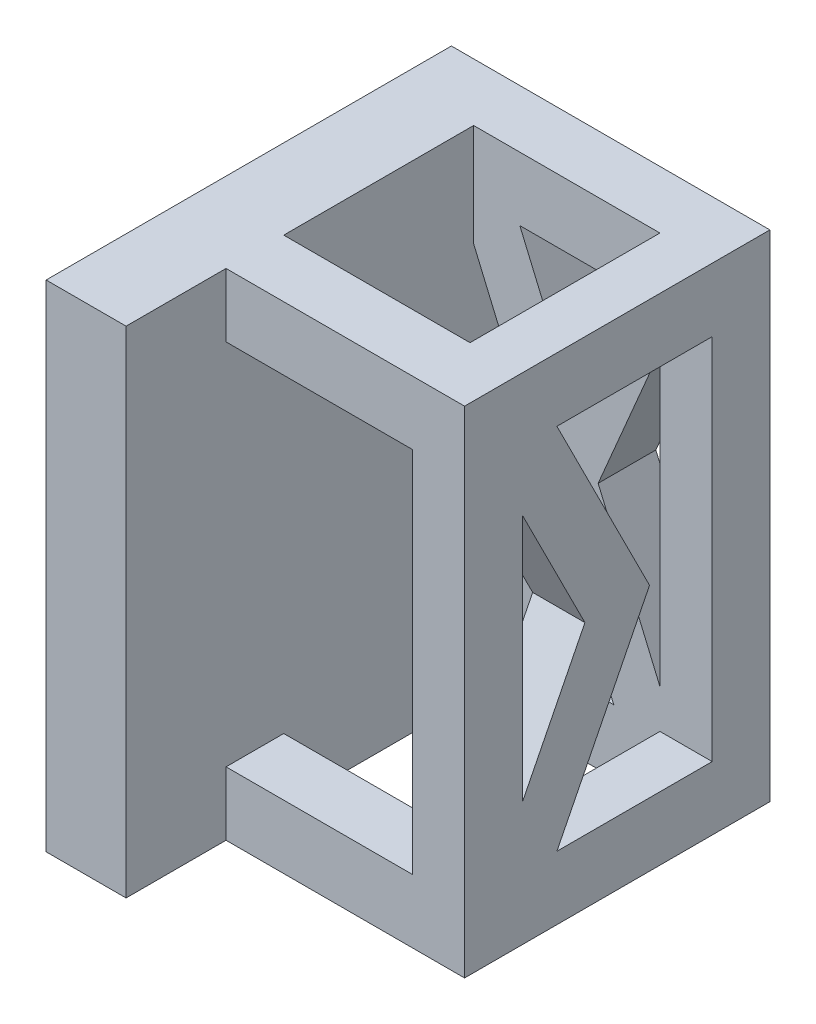
ISO-10303-21;
HEADER;
FILE_DESCRIPTION(('STEP AP214'),'2;1');
FILE_NAME('part.step','',(''),(''),'','','');
FILE_SCHEMA(('AUTOMOTIVE_DESIGN { 1 0 10303 214 1 1 1 1 }'));
ENDSEC;
DATA;
#1=APPLICATION_CONTEXT('core data for automotive mechanical design processes');
#2=APPLICATION_PROTOCOL_DEFINITION('international standard','automotive_design',2000,#1);
#3=PRODUCT_CONTEXT('',#1,'mechanical');
#4=PRODUCT('Part','Part','',(#3));
#5=PRODUCT_RELATED_PRODUCT_CATEGORY('part','',(#4));
#6=PRODUCT_DEFINITION_FORMATION('','',#4);
#7=PRODUCT_DEFINITION_CONTEXT('part definition',#1,'design');
#8=PRODUCT_DEFINITION('design','',#6,#7);
#9=PRODUCT_DEFINITION_SHAPE('','',#8);
#10=(LENGTH_UNIT() NAMED_UNIT(*) SI_UNIT(.MILLI.,.METRE.));
#11=(NAMED_UNIT(*) PLANE_ANGLE_UNIT() SI_UNIT($,.RADIAN.));
#12=(NAMED_UNIT(*) SI_UNIT($,.STERADIAN.) SOLID_ANGLE_UNIT());
#13=UNCERTAINTY_MEASURE_WITH_UNIT(LENGTH_MEASURE(1.E-05),#10,'distance_accuracy_value','');
#14=(GEOMETRIC_REPRESENTATION_CONTEXT(3) GLOBAL_UNCERTAINTY_ASSIGNED_CONTEXT((#13)) GLOBAL_UNIT_ASSIGNED_CONTEXT((#10,
#11,#12)) REPRESENTATION_CONTEXT('',''));
#15=CARTESIAN_POINT('',(0.,0.,0.));
#16=DIRECTION('',(0.,0.,1.));
#17=DIRECTION('',(1.,0.,0.));
#18=AXIS2_PLACEMENT_3D('',#15,#16,#17);
#19=CARTESIAN_POINT('',(0.,0.,-57.1875));
#20=DIRECTION('',(0.,0.,-1.));
#21=DIRECTION('',(-1.,0.,0.));
#22=AXIS2_PLACEMENT_3D('',#19,#20,#21);
#23=PLANE('',#22);
#24=DIRECTION('',(-1.,0.,0.));
#25=VECTOR('',#24,1.);
#26=CARTESIAN_POINT('',(0.,37.25,-57.1875));
#27=LINE('',#26,#25);
#28=CARTESIAN_POINT('',(10.25,37.25,-57.1875));
#29=VERTEX_POINT('',#28);
#30=CARTESIAN_POINT('',(-10.25,37.25,-57.1875));
#31=VERTEX_POINT('',#30);
#32=EDGE_CURVE('E74',#29,#31,#27,.T.);
#33=ORIENTED_EDGE('',*,*,#32,.F.);
#34=DIRECTION('',(0.,-1.,0.));
#35=VECTOR('',#34,1.);
#36=CARTESIAN_POINT('',(10.25,0.,-57.1875));
#37=LINE('',#36,#35);
#38=CARTESIAN_POINT('',(10.25,30.25,-57.1875));
#39=VERTEX_POINT('',#38);
#40=EDGE_CURVE('E621',#29,#39,#37,.T.);
#41=ORIENTED_EDGE('',*,*,#40,.T.);
#42=DIRECTION('',(-1.,0.,0.));
#43=VECTOR('',#42,1.);
#44=CARTESIAN_POINT('',(10.25,30.25,-57.1875));
#45=LINE('',#44,#43);
#46=CARTESIAN_POINT('',(-10.25,30.25,-57.1875));
#47=VERTEX_POINT('',#46);
#48=EDGE_CURVE('E405',#39,#47,#45,.T.);
#49=ORIENTED_EDGE('',*,*,#48,.T.);
#50=DIRECTION('',(0.,-1.,0.));
#51=VECTOR('',#50,1.);
#52=CARTESIAN_POINT('',(-10.25,37.25,-57.1875));
#53=LINE('',#52,#51);
#54=EDGE_CURVE('E407',#31,#47,#53,.T.);
#55=ORIENTED_EDGE('',*,*,#54,.F.);
#56=EDGE_LOOP('',(#33,#41,#49,#55));
#57=FACE_BOUND('',#56,.T.);
#58=ADVANCED_FACE('F59',(#57),#23,.T.);
#59=DIRECTION('',(1.,0.,0.));
#60=VECTOR('',#59,1.);
#61=CARTESIAN_POINT('',(-10.25,-10.25,-57.1875));
#62=LINE('',#61,#60);
#63=CARTESIAN_POINT('',(-10.25,-10.25,-57.1875));
#64=VERTEX_POINT('',#63);
#65=CARTESIAN_POINT('',(10.25,-10.25,-57.1875));
#66=VERTEX_POINT('',#65);
#67=EDGE_CURVE('E389',#64,#66,#62,.T.);
#68=ORIENTED_EDGE('',*,*,#67,.T.);
#69=DIRECTION('',(0.,-1.,0.));
#70=VECTOR('',#69,1.);
#71=CARTESIAN_POINT('',(10.25,0.,-57.1875));
#72=LINE('',#71,#70);
#73=CARTESIAN_POINT('',(10.25,-17.25,-57.1875));
#74=VERTEX_POINT('',#73);
#75=EDGE_CURVE('E82',#66,#74,#72,.T.);
#76=ORIENTED_EDGE('',*,*,#75,.T.);
#77=DIRECTION('',(1.,0.,0.));
#78=VECTOR('',#77,1.);
#79=CARTESIAN_POINT('',(-10.25,-17.25,-57.1875));
#80=LINE('',#79,#78);
#81=CARTESIAN_POINT('',(-10.25,-17.25,-57.1875));
#82=VERTEX_POINT('',#81);
#83=EDGE_CURVE('E383',#82,#74,#80,.T.);
#84=ORIENTED_EDGE('',*,*,#83,.F.);
#85=DIRECTION('',(0.,-1.,0.));
#86=VECTOR('',#85,1.);
#87=CARTESIAN_POINT('',(-10.25,-10.25,-57.1875));
#88=LINE('',#87,#86);
#89=EDGE_CURVE('E385',#64,#82,#88,.T.);
#90=ORIENTED_EDGE('',*,*,#89,.F.);
#91=EDGE_LOOP('',(#68,#76,#84,#90));
#92=FACE_BOUND('',#91,.T.);
#93=ADVANCED_FACE('F551',(#92),#23,.T.);
#94=CARTESIAN_POINT('',(-10.25,37.25,15.3683873672003));
#95=DIRECTION('',(1.,0.,0.));
#96=DIRECTION('',(0.,1.,0.));
#97=AXIS2_PLACEMENT_3D('',#94,#95,#96);
#98=PLANE('',#97);
#99=DIRECTION('',(0.,0.,1.));
#100=VECTOR('',#99,1.);
#101=CARTESIAN_POINT('',(-10.25,30.25,-57.1875));
#102=LINE('',#101,#100);
#103=CARTESIAN_POINT('',(-10.25,30.25,-50.8375));
#104=VERTEX_POINT('',#103);
#105=EDGE_CURVE('E396',#47,#104,#102,.T.);
#106=ORIENTED_EDGE('',*,*,#105,.T.);
#107=DIRECTION('',(0.,-1.,0.));
#108=VECTOR('',#107,1.);
#109=CARTESIAN_POINT('',(-10.25,37.25,-50.8375));
#110=LINE('',#109,#108);
#111=CARTESIAN_POINT('',(-10.25,37.25,-50.8375));
#112=VERTEX_POINT('',#111);
#113=EDGE_CURVE('E408',#112,#104,#110,.T.);
#114=ORIENTED_EDGE('',*,*,#113,.F.);
#115=DIRECTION('',(0.,0.,-1.));
#116=VECTOR('',#115,1.);
#117=CARTESIAN_POINT('',(-10.25,37.25,15.3683873672003));
#118=LINE('',#117,#116);
#119=CARTESIAN_POINT('',(-10.25,37.25,-39.8375));
#120=VERTEX_POINT('',#119);
#121=EDGE_CURVE('E424',#120,#112,#118,.T.);
#122=ORIENTED_EDGE('',*,*,#121,.F.);
#123=DIRECTION('',(0.,1.,0.));
#124=VECTOR('',#123,1.);
#125=CARTESIAN_POINT('',(-10.25,37.25,-39.8375));
#126=LINE('',#125,#124);
#127=CARTESIAN_POINT('',(-10.25,-17.25,-39.8375));
#128=VERTEX_POINT('',#127);
#129=EDGE_CURVE('E67',#128,#120,#126,.T.);
#130=ORIENTED_EDGE('',*,*,#129,.F.);
#131=DIRECTION('',(0.,0.,-1.));
#132=VECTOR('',#131,1.);
#133=CARTESIAN_POINT('',(-10.25,-17.25,15.3683873672003));
#134=LINE('',#133,#132);
#135=CARTESIAN_POINT('',(-10.25,-17.25,-50.8375));
#136=VERTEX_POINT('',#135);
#137=EDGE_CURVE('E433',#128,#136,#134,.T.);
#138=ORIENTED_EDGE('',*,*,#137,.T.);
#139=DIRECTION('',(0.,-1.,0.));
#140=VECTOR('',#139,1.);
#141=CARTESIAN_POINT('',(-10.25,-10.25,-50.8375));
#142=LINE('',#141,#140);
#143=CARTESIAN_POINT('',(-10.25,-10.25,-50.8375));
#144=VERTEX_POINT('',#143);
#145=EDGE_CURVE('E395',#144,#136,#142,.T.);
#146=ORIENTED_EDGE('',*,*,#145,.F.);
#147=DIRECTION('',(0.,0.,1.));
#148=VECTOR('',#147,1.);
#149=CARTESIAN_POINT('',(-10.25,-10.25,-57.1875));
#150=LINE('',#149,#148);
#151=EDGE_CURVE('E391',#64,#144,#150,.T.);
#152=ORIENTED_EDGE('',*,*,#151,.F.);
#153=ORIENTED_EDGE('',*,*,#89,.T.);
#154=CARTESIAN_POINT('',(-10.25,-17.25,-78.0875));
#155=VERTEX_POINT('',#154);
#156=EDGE_CURVE('E420',#82,#155,#134,.T.);
#157=ORIENTED_EDGE('',*,*,#156,.T.);
#158=DIRECTION('',(0.,-1.,0.));
#159=VECTOR('',#158,1.);
#160=CARTESIAN_POINT('',(-10.25,37.25,-78.0875));
#161=LINE('',#160,#159);
#162=CARTESIAN_POINT('',(-10.25,-5.97138937639835,-78.0875));
#163=VERTEX_POINT('',#162);
#164=EDGE_CURVE('E417',#163,#155,#161,.T.);
#165=ORIENTED_EDGE('',*,*,#164,.F.);
#166=DIRECTION('',(0.,0.,1.));
#167=VECTOR('',#166,1.);
#168=CARTESIAN_POINT('',(-10.25,-5.9713893763984,-84.4375));
#169=LINE('',#168,#167);
#170=CARTESIAN_POINT('',(-10.25,-5.9713893763984,-84.4375));
#171=VERTEX_POINT('',#170);
#172=EDGE_CURVE('E346',#171,#163,#169,.T.);
#173=ORIENTED_EDGE('',*,*,#172,.F.);
#174=DIRECTION('',(0.,-1.,0.));
#175=VECTOR('',#174,1.);
#176=CARTESIAN_POINT('',(-10.25,0.,-84.4375));
#177=LINE('',#176,#175);
#178=CARTESIAN_POINT('',(-10.25,25.9713893763984,-84.4375));
#179=VERTEX_POINT('',#178);
#180=EDGE_CURVE('E532',#179,#171,#177,.T.);
#181=ORIENTED_EDGE('',*,*,#180,.F.);
#182=DIRECTION('',(0.,0.,1.));
#183=VECTOR('',#182,1.);
#184=CARTESIAN_POINT('',(-10.25,25.9713893763984,-84.4375));
#185=LINE('',#184,#183);
#186=CARTESIAN_POINT('',(-10.25,25.9713893763984,-78.0875));
#187=VERTEX_POINT('',#186);
#188=EDGE_CURVE('E349',#179,#187,#185,.T.);
#189=ORIENTED_EDGE('',*,*,#188,.T.);
#190=CARTESIAN_POINT('',(-10.25,37.25,-78.0875));
#191=VERTEX_POINT('',#190);
#192=EDGE_CURVE('E418',#191,#187,#161,.T.);
#193=ORIENTED_EDGE('',*,*,#192,.F.);
#194=EDGE_CURVE('E429',#31,#191,#118,.T.);
#195=ORIENTED_EDGE('',*,*,#194,.F.);
#196=ORIENTED_EDGE('',*,*,#54,.T.);
#197=EDGE_LOOP('',(#106,#114,#122,#130,#138,#146,#152,#153,#157,#165,#173,#181,#189,#193,#195,#196));
#198=FACE_BOUND('',#197,.T.);
#199=ADVANCED_FACE('F61',(#198),#98,.T.);
#200=CARTESIAN_POINT('',(-10.25,37.25,15.3683873672003));
#201=DIRECTION('',(0.,1.,0.));
#202=DIRECTION('',(0.,0.,1.));
#203=AXIS2_PLACEMENT_3D('',#200,#201,#202);
#204=PLANE('',#203);
#205=DIRECTION('',(0.,0.,1.));
#206=VECTOR('',#205,1.);
#207=CARTESIAN_POINT('',(10.25,37.25,0.));
#208=LINE('',#207,#206);
#209=CARTESIAN_POINT('',(10.25,37.25,-78.0875));
#210=VERTEX_POINT('',#209);
#211=EDGE_CURVE('E623',#210,#29,#208,.T.);
#212=ORIENTED_EDGE('',*,*,#211,.T.);
#213=ORIENTED_EDGE('',*,*,#32,.T.);
#214=ORIENTED_EDGE('',*,*,#194,.T.);
#215=DIRECTION('',(-1.,0.,0.));
#216=VECTOR('',#215,1.);
#217=CARTESIAN_POINT('',(0.,37.25,-78.0875));
#218=LINE('',#217,#216);
#219=EDGE_CURVE('E313',#210,#191,#218,.T.);
#220=ORIENTED_EDGE('',*,*,#219,.F.);
#221=EDGE_LOOP('',(#212,#213,#214,#220));
#222=FACE_BOUND('',#221,.T.);
#223=DIRECTION('',(-1.,0.,0.));
#224=VECTOR('',#223,1.);
#225=CARTESIAN_POINT('',(-10.25,37.25,-39.8375));
#226=LINE('',#225,#224);
#227=CARTESIAN_POINT('',(-19.05,37.25,-39.8375));
#228=VERTEX_POINT('',#227);
#229=EDGE_CURVE('E423',#120,#228,#226,.T.);
#230=ORIENTED_EDGE('',*,*,#229,.F.);
#231=ORIENTED_EDGE('',*,*,#121,.T.);
#232=DIRECTION('',(-1.,0.,0.));
#233=VECTOR('',#232,1.);
#234=CARTESIAN_POINT('',(0.,37.25,-50.8375));
#235=LINE('',#234,#233);
#236=CARTESIAN_POINT('',(16.,37.25,-50.8375));
#237=VERTEX_POINT('',#236);
#238=EDGE_CURVE('E374',#237,#112,#235,.T.);
#239=ORIENTED_EDGE('',*,*,#238,.F.);
#240=DIRECTION('',(0.,0.,1.));
#241=VECTOR('',#240,1.);
#242=CARTESIAN_POINT('',(16.,37.25,-57.1875));
#243=LINE('',#242,#241);
#244=CARTESIAN_POINT('',(16.,37.25,-84.4375));
#245=VERTEX_POINT('',#244);
#246=EDGE_CURVE('E370',#245,#237,#243,.T.);
#247=ORIENTED_EDGE('',*,*,#246,.F.);
#248=DIRECTION('',(-1.,0.,0.));
#249=VECTOR('',#248,1.);
#250=CARTESIAN_POINT('',(0.,37.25,-84.4375));
#251=LINE('',#250,#249);
#252=CARTESIAN_POINT('',(-19.05,37.25,-84.4375));
#253=VERTEX_POINT('',#252);
#254=EDGE_CURVE('E491',#245,#253,#251,.T.);
#255=ORIENTED_EDGE('',*,*,#254,.T.);
#256=DIRECTION('',(0.,0.,-1.));
#257=VECTOR('',#256,1.);
#258=CARTESIAN_POINT('',(-19.05,37.25,15.3683873672003));
#259=LINE('',#258,#257);
#260=EDGE_CURVE('E430',#228,#253,#259,.T.);
#261=ORIENTED_EDGE('',*,*,#260,.F.);
#262=EDGE_LOOP('',(#230,#231,#239,#247,#255,#261));
#263=FACE_BOUND('',#262,.T.);
#264=ADVANCED_FACE('F654',(#222,#263),#204,.T.);
#265=CARTESIAN_POINT('',(-19.05,37.25,15.3683873672003));
#266=DIRECTION('',(-1.,0.,0.));
#267=DIRECTION('',(0.,-1.,0.));
#268=AXIS2_PLACEMENT_3D('',#265,#266,#267);
#269=PLANE('',#268);
#270=DIRECTION('',(0.,-1.,0.));
#271=VECTOR('',#270,1.);
#272=CARTESIAN_POINT('',(-19.05,37.25,-39.8375));
#273=LINE('',#272,#271);
#274=CARTESIAN_POINT('',(-19.05,-17.25,-39.8375));
#275=VERTEX_POINT('',#274);
#276=EDGE_CURVE('E421',#228,#275,#273,.T.);
#277=ORIENTED_EDGE('',*,*,#276,.F.);
#278=ORIENTED_EDGE('',*,*,#260,.T.);
#279=DIRECTION('',(0.,1.,0.));
#280=VECTOR('',#279,1.);
#281=CARTESIAN_POINT('',(-19.05,0.,-84.4375));
#282=LINE('',#281,#280);
#283=CARTESIAN_POINT('',(-19.05,-17.25,-84.4375));
#284=VERTEX_POINT('',#283);
#285=EDGE_CURVE('E488',#284,#253,#282,.T.);
#286=ORIENTED_EDGE('',*,*,#285,.F.);
#287=DIRECTION('',(0.,0.,-1.));
#288=VECTOR('',#287,1.);
#289=CARTESIAN_POINT('',(-19.05,-17.25,15.3683873672003));
#290=LINE('',#289,#288);
#291=EDGE_CURVE('E432',#275,#284,#290,.T.);
#292=ORIENTED_EDGE('',*,*,#291,.F.);
#293=EDGE_LOOP('',(#277,#278,#286,#292));
#294=FACE_BOUND('',#293,.T.);
#295=ADVANCED_FACE('F767',(#294),#269,.T.);
#296=CARTESIAN_POINT('',(-10.25,-17.25,15.3683873672003));
#297=DIRECTION('',(0.,-1.,0.));
#298=DIRECTION('',(0.,0.,-1.));
#299=AXIS2_PLACEMENT_3D('',#296,#297,#298);
#300=PLANE('',#299);
#301=DIRECTION('',(-1.,0.,0.));
#302=VECTOR('',#301,1.);
#303=CARTESIAN_POINT('',(0.,-17.25,-84.4375));
#304=LINE('',#303,#302);
#305=CARTESIAN_POINT('',(16.,-17.25,-84.4375));
#306=VERTEX_POINT('',#305);
#307=EDGE_CURVE('E480',#306,#284,#304,.T.);
#308=ORIENTED_EDGE('',*,*,#307,.F.);
#309=DIRECTION('',(0.,0.,1.));
#310=VECTOR('',#309,1.);
#311=CARTESIAN_POINT('',(16.,-17.25,-57.1875));
#312=LINE('',#311,#310);
#313=CARTESIAN_POINT('',(16.,-17.25,-50.8375));
#314=VERTEX_POINT('',#313);
#315=EDGE_CURVE('E375',#306,#314,#312,.T.);
#316=ORIENTED_EDGE('',*,*,#315,.T.);
#317=DIRECTION('',(1.,0.,0.));
#318=VECTOR('',#317,1.);
#319=CARTESIAN_POINT('',(-10.25,-17.25,-50.8375));
#320=LINE('',#319,#318);
#321=EDGE_CURVE('E392',#136,#314,#320,.T.);
#322=ORIENTED_EDGE('',*,*,#321,.F.);
#323=ORIENTED_EDGE('',*,*,#137,.F.);
#324=DIRECTION('',(1.,0.,0.));
#325=VECTOR('',#324,1.);
#326=CARTESIAN_POINT('',(-10.25,-17.25,-39.8375));
#327=LINE('',#326,#325);
#328=EDGE_CURVE('E12',#275,#128,#327,.T.);
#329=ORIENTED_EDGE('',*,*,#328,.F.);
#330=ORIENTED_EDGE('',*,*,#291,.T.);
#331=EDGE_LOOP('',(#308,#316,#322,#323,#329,#330));
#332=FACE_BOUND('',#331,.T.);
#333=ORIENTED_EDGE('',*,*,#83,.T.);
#334=DIRECTION('',(0.,0.,-1.));
#335=VECTOR('',#334,1.);
#336=CARTESIAN_POINT('',(10.25,-17.25,0.));
#337=LINE('',#336,#335);
#338=CARTESIAN_POINT('',(10.25,-17.25,-78.0875));
#339=VERTEX_POINT('',#338);
#340=EDGE_CURVE('E523',#74,#339,#337,.T.);
#341=ORIENTED_EDGE('',*,*,#340,.T.);
#342=DIRECTION('',(-1.,0.,0.));
#343=VECTOR('',#342,1.);
#344=CARTESIAN_POINT('',(0.,-17.25,-78.0875));
#345=LINE('',#344,#343);
#346=EDGE_CURVE('E310',#339,#155,#345,.T.);
#347=ORIENTED_EDGE('',*,*,#346,.T.);
#348=ORIENTED_EDGE('',*,*,#156,.F.);
#349=EDGE_LOOP('',(#333,#341,#347,#348));
#350=FACE_BOUND('',#349,.T.);
#351=ADVANCED_FACE('F639',(#332,#350),#300,.T.);
#352=CARTESIAN_POINT('',(0.,10.0190841311277,-39.8375));
#353=DIRECTION('',(0.,0.,-1.));
#354=DIRECTION('',(0.,1.,0.));
#355=AXIS2_PLACEMENT_3D('',#352,#353,#354);
#356=PLANE('',#355);
#357=ORIENTED_EDGE('',*,*,#129,.T.);
#358=ORIENTED_EDGE('',*,*,#229,.T.);
#359=ORIENTED_EDGE('',*,*,#276,.T.);
#360=ORIENTED_EDGE('',*,*,#328,.T.);
#361=EDGE_LOOP('',(#357,#358,#359,#360));
#362=FACE_BOUND('',#361,.T.);
#363=ADVANCED_FACE('F778',(#362),#356,.F.);
#364=CARTESIAN_POINT('',(16.,0.,-57.1875));
#365=DIRECTION('',(1.,0.,0.));
#366=DIRECTION('',(0.,1.,0.));
#367=AXIS2_PLACEMENT_3D('',#364,#365,#366);
#368=PLANE('',#367);
#369=DIRECTION('',(0.,-1.,0.));
#370=VECTOR('',#369,1.);
#371=CARTESIAN_POINT('',(16.,0.,-84.4375));
#372=LINE('',#371,#370);
#373=EDGE_CURVE('E476',#245,#306,#372,.T.);
#374=ORIENTED_EDGE('',*,*,#373,.F.);
#375=ORIENTED_EDGE('',*,*,#246,.T.);
#376=DIRECTION('',(0.,1.,0.));
#377=VECTOR('',#376,1.);
#378=CARTESIAN_POINT('',(16.,0.,-50.8375));
#379=LINE('',#378,#377);
#380=EDGE_CURVE('E365',#314,#237,#379,.T.);
#381=ORIENTED_EDGE('',*,*,#380,.F.);
#382=ORIENTED_EDGE('',*,*,#315,.F.);
#383=EDGE_LOOP('',(#374,#375,#381,#382));
#384=FACE_BOUND('',#383,.T.);
#385=DIRECTION('',(0.,1.,0.));
#386=VECTOR('',#385,1.);
#387=CARTESIAN_POINT('',(16.,0.,-57.1875));
#388=LINE('',#387,#386);
#389=CARTESIAN_POINT('',(16.,-3.69646346391572,-57.1875));
#390=VERTEX_POINT('',#389);
#391=CARTESIAN_POINT('',(16.,23.6964634639157,-57.1875));
#392=VERTEX_POINT('',#391);
#393=EDGE_CURVE('E367',#390,#392,#388,.T.);
#394=ORIENTED_EDGE('',*,*,#393,.T.);
#395=DIRECTION('',(0.,-0.893194857293405,-0.449669819872998));
#396=VECTOR('',#395,1.);
#397=CARTESIAN_POINT('',(16.,27.760440686772,-55.1415322127387));
#398=LINE('',#397,#396);
#399=CARTESIAN_POINT('',(16.,10.,-64.0828445134906));
#400=VERTEX_POINT('',#399);
#401=EDGE_CURVE('E586',#392,#400,#398,.T.);
#402=ORIENTED_EDGE('',*,*,#401,.T.);
#403=DIRECTION('',(0.,-0.893194857293405,0.449669819872998));
#404=VECTOR('',#403,1.);
#405=CARTESIAN_POINT('',(16.,-23.7163817486797,-47.1086768009265));
#406=LINE('',#405,#404);
#407=EDGE_CURVE('E303',#400,#390,#406,.T.);
#408=ORIENTED_EDGE('',*,*,#407,.T.);
#409=EDGE_LOOP('',(#394,#402,#408));
#410=FACE_BOUND('',#409,.T.);
#411=DIRECTION('',(0.,-1.,0.));
#412=VECTOR('',#411,1.);
#413=CARTESIAN_POINT('',(16.,0.,-78.0875));
#414=LINE('',#413,#412);
#415=CARTESIAN_POINT('',(16.,30.25,-78.0875));
#416=VERTEX_POINT('',#415);
#417=CARTESIAN_POINT('',(16.,-10.25,-78.0875));
#418=VERTEX_POINT('',#417);
#419=EDGE_CURVE('E300',#416,#418,#414,.T.);
#420=ORIENTED_EDGE('',*,*,#419,.T.);
#421=DIRECTION('',(0.,0.,1.));
#422=VECTOR('',#421,1.);
#423=CARTESIAN_POINT('',(16.,-10.25,0.));
#424=LINE('',#423,#422);
#425=CARTESIAN_POINT('',(16.,-10.25,-60.9975));
#426=VERTEX_POINT('',#425);
#427=EDGE_CURVE('E282',#418,#426,#424,.T.);
#428=ORIENTED_EDGE('',*,*,#427,.T.);
#429=DIRECTION('',(0.,0.893194857293405,-0.449669819872998));
#430=VECTOR('',#429,1.);
#431=CARTESIAN_POINT('',(16.,-26.5717851048732,-52.7804641447396));
#432=LINE('',#431,#430);
#433=CARTESIAN_POINT('',(16.,10.,-71.1921554865094));
#434=VERTEX_POINT('',#433);
#435=EDGE_CURVE('E294',#426,#434,#432,.T.);
#436=ORIENTED_EDGE('',*,*,#435,.T.);
#437=DIRECTION('',(0.,-0.893194857293405,-0.449669819872998));
#438=VECTOR('',#437,1.);
#439=CARTESIAN_POINT('',(16.,30.6158440429655,-60.8133195565518));
#440=LINE('',#439,#438);
#441=CARTESIAN_POINT('',(16.,30.25,-60.9975));
#442=VERTEX_POINT('',#441);
#443=EDGE_CURVE('E592',#442,#434,#440,.T.);
#444=ORIENTED_EDGE('',*,*,#443,.F.);
#445=DIRECTION('',(0.,0.,-1.));
#446=VECTOR('',#445,1.);
#447=CARTESIAN_POINT('',(16.,30.25,0.));
#448=LINE('',#447,#446);
#449=EDGE_CURVE('E308',#442,#416,#448,.T.);
#450=ORIENTED_EDGE('',*,*,#449,.T.);
#451=EDGE_LOOP('',(#420,#428,#436,#444,#450));
#452=FACE_BOUND('',#451,.T.);
#453=ADVANCED_FACE('F305',(#384,#410,#452),#368,.T.);
#454=CARTESIAN_POINT('',(0.,0.,-50.8375));
#455=DIRECTION('',(0.,0.,-1.));
#456=DIRECTION('',(-1.,0.,0.));
#457=AXIS2_PLACEMENT_3D('',#454,#455,#456);
#458=PLANE('',#457);
#459=DIRECTION('',(0.,1.,0.));
#460=VECTOR('',#459,1.);
#461=CARTESIAN_POINT('',(10.25,0.,-50.8375));
#462=LINE('',#461,#460);
#463=CARTESIAN_POINT('',(10.25,-10.25,-50.8375));
#464=VERTEX_POINT('',#463);
#465=CARTESIAN_POINT('',(10.25,30.25,-50.8375));
#466=VERTEX_POINT('',#465);
#467=EDGE_CURVE('E371',#464,#466,#462,.T.);
#468=ORIENTED_EDGE('',*,*,#467,.F.);
#469=DIRECTION('',(1.,0.,0.));
#470=VECTOR('',#469,1.);
#471=CARTESIAN_POINT('',(-10.25,-10.25,-50.8375));
#472=LINE('',#471,#470);
#473=EDGE_CURVE('E386',#144,#464,#472,.T.);
#474=ORIENTED_EDGE('',*,*,#473,.F.);
#475=ORIENTED_EDGE('',*,*,#145,.T.);
#476=ORIENTED_EDGE('',*,*,#321,.T.);
#477=ORIENTED_EDGE('',*,*,#380,.T.);
#478=ORIENTED_EDGE('',*,*,#238,.T.);
#479=ORIENTED_EDGE('',*,*,#113,.T.);
#480=DIRECTION('',(-1.,0.,0.));
#481=VECTOR('',#480,1.);
#482=CARTESIAN_POINT('',(10.25,30.25,-50.8375));
#483=LINE('',#482,#481);
#484=EDGE_CURVE('E338',#466,#104,#483,.T.);
#485=ORIENTED_EDGE('',*,*,#484,.F.);
#486=EDGE_LOOP('',(#468,#474,#475,#476,#477,#478,#479,#485));
#487=FACE_BOUND('',#486,.T.);
#488=ADVANCED_FACE('F561',(#487),#458,.F.);
#489=DIRECTION('',(1.,0.,0.));
#490=VECTOR('',#489,1.);
#491=CARTESIAN_POINT('',(-48.120026554731,23.6964634639157,-57.1875));
#492=LINE('',#491,#490);
#493=CARTESIAN_POINT('',(10.25,23.6964634639157,-57.1875));
#494=VERTEX_POINT('',#493);
#495=EDGE_CURVE('E573',#494,#392,#492,.T.);
#496=ORIENTED_EDGE('',*,*,#495,.T.);
#497=ORIENTED_EDGE('',*,*,#393,.F.);
#498=DIRECTION('',(1.,0.,0.));
#499=VECTOR('',#498,1.);
#500=CARTESIAN_POINT('',(-48.120026554731,-3.69646346391573,-57.1875));
#501=LINE('',#500,#499);
#502=CARTESIAN_POINT('',(10.25,-3.69646346391573,-57.1875));
#503=VERTEX_POINT('',#502);
#504=EDGE_CURVE('E596',#503,#390,#501,.T.);
#505=ORIENTED_EDGE('',*,*,#504,.F.);
#506=DIRECTION('',(0.,1.,0.));
#507=VECTOR('',#506,1.);
#508=CARTESIAN_POINT('',(10.25,0.,-57.1875));
#509=LINE('',#508,#507);
#510=EDGE_CURVE('E363',#503,#494,#509,.T.);
#511=ORIENTED_EDGE('',*,*,#510,.T.);
#512=EDGE_LOOP('',(#496,#497,#505,#511));
#513=FACE_BOUND('',#512,.T.);
#514=ADVANCED_FACE('F553',(#513),#23,.T.);
#515=CARTESIAN_POINT('',(10.25,0.,-57.1875));
#516=DIRECTION('',(1.,0.,0.));
#517=DIRECTION('',(0.,0.,-1.));
#518=AXIS2_PLACEMENT_3D('',#515,#516,#517);
#519=PLANE('',#518);
#520=DIRECTION('',(0.,0.893194857293405,0.449669819872998));
#521=VECTOR('',#520,1.);
#522=CARTESIAN_POINT('',(10.25,27.760440686772,-55.1415322127387));
#523=LINE('',#522,#521);
#524=CARTESIAN_POINT('',(10.25,10.,-64.0828445134906));
#525=VERTEX_POINT('',#524);
#526=EDGE_CURVE('E619',#525,#494,#523,.T.);
#527=ORIENTED_EDGE('',*,*,#526,.T.);
#528=ORIENTED_EDGE('',*,*,#510,.F.);
#529=DIRECTION('',(0.,0.893194857293405,-0.449669819872998));
#530=VECTOR('',#529,1.);
#531=CARTESIAN_POINT('',(10.25,-23.7163817486797,-47.1086768009265));
#532=LINE('',#531,#530);
#533=EDGE_CURVE('E617',#503,#525,#532,.T.);
#534=ORIENTED_EDGE('',*,*,#533,.T.);
#535=EDGE_LOOP('',(#527,#528,#534));
#536=FACE_BOUND('',#535,.T.);
#537=DIRECTION('',(0.,0.,1.));
#538=VECTOR('',#537,1.);
#539=CARTESIAN_POINT('',(10.25,30.25,-57.1875));
#540=LINE('',#539,#538);
#541=EDGE_CURVE('E382',#39,#466,#540,.T.);
#542=ORIENTED_EDGE('',*,*,#541,.F.);
#543=ORIENTED_EDGE('',*,*,#40,.F.);
#544=ORIENTED_EDGE('',*,*,#211,.F.);
#545=DIRECTION('',(0.,1.,0.));
#546=VECTOR('',#545,1.);
#547=CARTESIAN_POINT('',(10.25,0.,-78.0875));
#548=LINE('',#547,#546);
#549=CARTESIAN_POINT('',(10.25,30.25,-78.0875));
#550=VERTEX_POINT('',#549);
#551=EDGE_CURVE('E626',#550,#210,#548,.T.);
#552=ORIENTED_EDGE('',*,*,#551,.F.);
#553=DIRECTION('',(0.,0.,1.));
#554=VECTOR('',#553,1.);
#555=CARTESIAN_POINT('',(10.25,30.25,0.));
#556=LINE('',#555,#554);
#557=CARTESIAN_POINT('',(10.25,30.25,-60.9975));
#558=VERTEX_POINT('',#557);
#559=EDGE_CURVE('E629',#550,#558,#556,.T.);
#560=ORIENTED_EDGE('',*,*,#559,.T.);
#561=DIRECTION('',(0.,0.893194857293405,0.449669819872998));
#562=VECTOR('',#561,1.);
#563=CARTESIAN_POINT('',(10.25,30.6158440429655,-60.8133195565518));
#564=LINE('',#563,#562);
#565=CARTESIAN_POINT('',(10.25,10.,-71.1921554865094));
#566=VERTEX_POINT('',#565);
#567=EDGE_CURVE('E631',#566,#558,#564,.T.);
#568=ORIENTED_EDGE('',*,*,#567,.F.);
#569=DIRECTION('',(0.,-0.893194857293405,0.449669819872998));
#570=VECTOR('',#569,1.);
#571=CARTESIAN_POINT('',(10.25,-26.5717851048732,-52.7804641447396));
#572=LINE('',#571,#570);
#573=CARTESIAN_POINT('',(10.25,-10.25,-60.9975));
#574=VERTEX_POINT('',#573);
#575=EDGE_CURVE('E609',#566,#574,#572,.T.);
#576=ORIENTED_EDGE('',*,*,#575,.T.);
#577=DIRECTION('',(0.,0.,-1.));
#578=VECTOR('',#577,1.);
#579=CARTESIAN_POINT('',(10.25,-10.25,0.));
#580=LINE('',#579,#578);
#581=CARTESIAN_POINT('',(10.25,-10.25,-78.0875));
#582=VERTEX_POINT('',#581);
#583=EDGE_CURVE('E634',#574,#582,#580,.T.);
#584=ORIENTED_EDGE('',*,*,#583,.T.);
#585=DIRECTION('',(0.,-1.,0.));
#586=VECTOR('',#585,1.);
#587=CARTESIAN_POINT('',(10.25,0.,-78.0875));
#588=LINE('',#587,#586);
#589=EDGE_CURVE('E302',#582,#339,#588,.T.);
#590=ORIENTED_EDGE('',*,*,#589,.T.);
#591=ORIENTED_EDGE('',*,*,#340,.F.);
#592=ORIENTED_EDGE('',*,*,#75,.F.);
#593=DIRECTION('',(0.,0.,1.));
#594=VECTOR('',#593,1.);
#595=CARTESIAN_POINT('',(10.25,-10.25,-57.1875));
#596=LINE('',#595,#594);
#597=EDGE_CURVE('E380',#66,#464,#596,.T.);
#598=ORIENTED_EDGE('',*,*,#597,.T.);
#599=ORIENTED_EDGE('',*,*,#467,.T.);
#600=EDGE_LOOP('',(#542,#543,#544,#552,#560,#568,#576,#584,#590,#591,#592,#598,#599));
#601=FACE_BOUND('',#600,.T.);
#602=ADVANCED_FACE('F560',(#536,#601),#519,.F.);
#603=CARTESIAN_POINT('',(10.25,30.25,-57.1875));
#604=DIRECTION('',(0.,1.,0.));
#605=DIRECTION('',(0.,0.,1.));
#606=AXIS2_PLACEMENT_3D('',#603,#604,#605);
#607=PLANE('',#606);
#608=ORIENTED_EDGE('',*,*,#484,.T.);
#609=ORIENTED_EDGE('',*,*,#105,.F.);
#610=ORIENTED_EDGE('',*,*,#48,.F.);
#611=ORIENTED_EDGE('',*,*,#541,.T.);
#612=EDGE_LOOP('',(#608,#609,#610,#611));
#613=FACE_BOUND('',#612,.T.);
#614=ADVANCED_FACE('F567',(#613),#607,.F.);
#615=CARTESIAN_POINT('',(-10.25,-10.25,-57.1875));
#616=DIRECTION('',(0.,-1.,0.));
#617=DIRECTION('',(1.,0.,0.));
#618=AXIS2_PLACEMENT_3D('',#615,#616,#617);
#619=PLANE('',#618);
#620=ORIENTED_EDGE('',*,*,#597,.F.);
#621=ORIENTED_EDGE('',*,*,#67,.F.);
#622=ORIENTED_EDGE('',*,*,#151,.T.);
#623=ORIENTED_EDGE('',*,*,#473,.T.);
#624=EDGE_LOOP('',(#620,#621,#622,#623));
#625=FACE_BOUND('',#624,.T.);
#626=ADVANCED_FACE('F570',(#625),#619,.F.);
#627=CARTESIAN_POINT('',(0.,0.,-78.0875));
#628=DIRECTION('',(0.,0.,-1.));
#629=DIRECTION('',(-1.,0.,0.));
#630=AXIS2_PLACEMENT_3D('',#627,#628,#629);
#631=PLANE('',#630);
#632=DIRECTION('',(-0.391698029375813,0.920093828793077,0.));
#633=VECTOR('',#632,1.);
#634=CARTESIAN_POINT('',(0.68269148937293,0.290632218900746,-78.0875));
#635=LINE('',#634,#633);
#636=CARTESIAN_POINT('',(5.17,-10.25,-78.0875));
#637=VERTEX_POINT('',#636);
#638=CARTESIAN_POINT('',(0.,1.89426608793643,-78.0875));
#639=VERTEX_POINT('',#638);
#640=EDGE_CURVE('E500',#637,#639,#635,.T.);
#641=ORIENTED_EDGE('',*,*,#640,.F.);
#642=DIRECTION('',(1.,0.,0.));
#643=VECTOR('',#642,1.);
#644=CARTESIAN_POINT('',(0.,-10.25,-78.0875));
#645=LINE('',#644,#643);
#646=CARTESIAN_POINT('',(-5.17000000000001,-10.25,-78.0875));
#647=VERTEX_POINT('',#646);
#648=EDGE_CURVE('E450',#647,#637,#645,.T.);
#649=ORIENTED_EDGE('',*,*,#648,.F.);
#650=DIRECTION('',(-0.391698029375813,-0.920093828793077,0.));
#651=VECTOR('',#650,1.);
#652=CARTESIAN_POINT('',(-0.682691489372934,0.290632218900748,-78.0875));
#653=LINE('',#652,#651);
#654=EDGE_CURVE('E454',#639,#647,#653,.T.);
#655=ORIENTED_EDGE('',*,*,#654,.F.);
#656=EDGE_LOOP('',(#641,#649,#655));
#657=FACE_BOUND('',#656,.T.);
#658=DIRECTION('',(-0.391698029375813,-0.920093828793077,0.));
#659=VECTOR('',#658,1.);
#660=CARTESIAN_POINT('',(-0.682691489372934,0.290632218900748,-78.0875));
#661=LINE('',#660,#659);
#662=CARTESIAN_POINT('',(10.25,25.9713893763984,-78.0875));
#663=VERTEX_POINT('',#662);
#664=CARTESIAN_POINT('',(3.45073502358424,9.99999999999999,-78.0875));
#665=VERTEX_POINT('',#664);
#666=EDGE_CURVE('E452',#663,#665,#661,.T.);
#667=ORIENTED_EDGE('',*,*,#666,.F.);
#668=DIRECTION('',(0.,-1.,0.));
#669=VECTOR('',#668,1.);
#670=CARTESIAN_POINT('',(10.25,0.,-78.0875));
#671=LINE('',#670,#669);
#672=CARTESIAN_POINT('',(10.25,-5.97138937639842,-78.0875));
#673=VERTEX_POINT('',#672);
#674=EDGE_CURVE('E311',#663,#673,#671,.T.);
#675=ORIENTED_EDGE('',*,*,#674,.T.);
#676=DIRECTION('',(0.391698029375813,-0.920093828793078,0.));
#677=VECTOR('',#676,1.);
#678=CARTESIAN_POINT('',(6.52528730220897,2.77791470543715,-78.0875));
#679=LINE('',#678,#677);
#680=EDGE_CURVE('E316',#665,#673,#679,.T.);
#681=ORIENTED_EDGE('',*,*,#680,.F.);
#682=EDGE_LOOP('',(#667,#675,#681));
#683=FACE_BOUND('',#682,.T.);
#684=DIRECTION('',(0.391698029375813,-0.920093828793078,0.));
#685=VECTOR('',#684,1.);
#686=CARTESIAN_POINT('',(6.52528730220897,2.77791470543715,-78.0875));
#687=LINE('',#686,#685);
#688=CARTESIAN_POINT('',(-5.17000000000001,30.25,-78.0875));
#689=VERTEX_POINT('',#688);
#690=CARTESIAN_POINT('',(0.,18.1057339120636,-78.0875));
#691=VERTEX_POINT('',#690);
#692=EDGE_CURVE('E321',#689,#691,#687,.T.);
#693=ORIENTED_EDGE('',*,*,#692,.F.);
#694=DIRECTION('',(-1.,0.,0.));
#695=VECTOR('',#694,1.);
#696=CARTESIAN_POINT('',(0.,30.25,-78.0875));
#697=LINE('',#696,#695);
#698=CARTESIAN_POINT('',(5.17,30.25,-78.0875));
#699=VERTEX_POINT('',#698);
#700=EDGE_CURVE('E327',#699,#689,#697,.T.);
#701=ORIENTED_EDGE('',*,*,#700,.F.);
#702=DIRECTION('',(-0.391698029375813,-0.920093828793077,0.));
#703=VECTOR('',#702,1.);
#704=CARTESIAN_POINT('',(-6.52528730220897,2.77791470543716,-78.0875));
#705=LINE('',#704,#703);
#706=EDGE_CURVE('E324',#699,#691,#705,.T.);
#707=ORIENTED_EDGE('',*,*,#706,.T.);
#708=EDGE_LOOP('',(#693,#701,#707));
#709=FACE_BOUND('',#708,.T.);
#710=ORIENTED_EDGE('',*,*,#419,.F.);
#711=DIRECTION('',(1.,0.,0.));
#712=VECTOR('',#711,1.);
#713=CARTESIAN_POINT('',(-48.120026554731,30.25,-78.0875));
#714=LINE('',#713,#712);
#715=EDGE_CURVE('E581',#550,#416,#714,.T.);
#716=ORIENTED_EDGE('',*,*,#715,.F.);
#717=ORIENTED_EDGE('',*,*,#551,.T.);
#718=ORIENTED_EDGE('',*,*,#219,.T.);
#719=ORIENTED_EDGE('',*,*,#192,.T.);
#720=DIRECTION('',(-0.391698029375813,0.920093828793077,0.));
#721=VECTOR('',#720,1.);
#722=CARTESIAN_POINT('',(0.68269148937293,0.290632218900746,-78.0875));
#723=LINE('',#722,#721);
#724=CARTESIAN_POINT('',(-3.45073502358425,10.,-78.0875));
#725=VERTEX_POINT('',#724);
#726=EDGE_CURVE('E448',#725,#187,#723,.T.);
#727=ORIENTED_EDGE('',*,*,#726,.F.);
#728=DIRECTION('',(-0.391698029375813,-0.920093828793077,0.));
#729=VECTOR('',#728,1.);
#730=CARTESIAN_POINT('',(-6.52528730220897,2.77791470543716,-78.0875));
#731=LINE('',#730,#729);
#732=EDGE_CURVE('E446',#725,#163,#731,.T.);
#733=ORIENTED_EDGE('',*,*,#732,.T.);
#734=ORIENTED_EDGE('',*,*,#164,.T.);
#735=ORIENTED_EDGE('',*,*,#346,.F.);
#736=ORIENTED_EDGE('',*,*,#589,.F.);
#737=DIRECTION('',(1.,0.,0.));
#738=VECTOR('',#737,1.);
#739=CARTESIAN_POINT('',(-48.120026554731,-10.25,-78.0875));
#740=LINE('',#739,#738);
#741=EDGE_CURVE('E286',#582,#418,#740,.T.);
#742=ORIENTED_EDGE('',*,*,#741,.T.);
#743=EDGE_LOOP('',(#710,#716,#717,#718,#719,#727,#733,#734,#735,#736,#742));
#744=FACE_BOUND('',#743,.T.);
#745=ADVANCED_FACE('F298',(#657,#683,#709,#744),#631,.F.);
#746=CARTESIAN_POINT('',(6.52528730220897,2.77791470543715,-84.4375));
#747=DIRECTION('',(-0.920093828793078,-0.391698029375813,0.));
#748=DIRECTION('',(0.391698029375813,-0.920093828793078,0.));
#749=AXIS2_PLACEMENT_3D('',#746,#747,#748);
#750=PLANE('',#749);
#751=ORIENTED_EDGE('',*,*,#692,.T.);
#752=DIRECTION('',(0.,0.,1.));
#753=VECTOR('',#752,1.);
#754=CARTESIAN_POINT('',(0.,18.1057339120636,-84.4375));
#755=LINE('',#754,#753);
#756=CARTESIAN_POINT('',(0.,18.1057339120636,-84.4375));
#757=VERTEX_POINT('',#756);
#758=EDGE_CURVE('E336',#757,#691,#755,.T.);
#759=ORIENTED_EDGE('',*,*,#758,.F.);
#760=DIRECTION('',(0.391698029375813,-0.920093828793078,0.));
#761=VECTOR('',#760,1.);
#762=CARTESIAN_POINT('',(6.52528730220897,2.77791470543715,-84.4375));
#763=LINE('',#762,#761);
#764=CARTESIAN_POINT('',(-5.17000000000001,30.25,-84.4375));
#765=VERTEX_POINT('',#764);
#766=EDGE_CURVE('E494',#765,#757,#763,.T.);
#767=ORIENTED_EDGE('',*,*,#766,.F.);
#768=DIRECTION('',(0.,0.,1.));
#769=VECTOR('',#768,1.);
#770=CARTESIAN_POINT('',(-5.17000000000001,30.25,-84.4375));
#771=LINE('',#770,#769);
#772=EDGE_CURVE('E330',#765,#689,#771,.T.);
#773=ORIENTED_EDGE('',*,*,#772,.T.);
#774=EDGE_LOOP('',(#751,#759,#767,#773));
#775=FACE_BOUND('',#774,.T.);
#776=ADVANCED_FACE('F546',(#775),#750,.F.);
#777=CARTESIAN_POINT('',(-6.52528730220897,2.77791470543716,-84.4375));
#778=DIRECTION('',(-0.920093828793077,0.391698029375813,0.));
#779=DIRECTION('',(-0.391698029375813,-0.920093828793077,0.));
#780=AXIS2_PLACEMENT_3D('',#777,#778,#779);
#781=PLANE('',#780);
#782=ORIENTED_EDGE('',*,*,#706,.F.);
#783=DIRECTION('',(0.,0.,1.));
#784=VECTOR('',#783,1.);
#785=CARTESIAN_POINT('',(5.17,30.25,-84.4375));
#786=LINE('',#785,#784);
#787=CARTESIAN_POINT('',(5.17,30.25,-84.4375));
#788=VERTEX_POINT('',#787);
#789=EDGE_CURVE('E333',#788,#699,#786,.T.);
#790=ORIENTED_EDGE('',*,*,#789,.F.);
#791=DIRECTION('',(-0.391698029375813,-0.920093828793077,0.));
#792=VECTOR('',#791,1.);
#793=CARTESIAN_POINT('',(-6.52528730220897,2.77791470543716,-84.4375));
#794=LINE('',#793,#792);
#795=EDGE_CURVE('E496',#788,#757,#794,.T.);
#796=ORIENTED_EDGE('',*,*,#795,.T.);
#797=ORIENTED_EDGE('',*,*,#758,.T.);
#798=EDGE_LOOP('',(#782,#790,#796,#797));
#799=FACE_BOUND('',#798,.T.);
#800=ADVANCED_FACE('F538',(#799),#781,.T.);
#801=CARTESIAN_POINT('',(-0.682691489372934,0.290632218900748,-84.4375));
#802=DIRECTION('',(-0.920093828793077,0.391698029375813,0.));
#803=DIRECTION('',(-0.391698029375813,-0.920093828793077,0.));
#804=AXIS2_PLACEMENT_3D('',#801,#802,#803);
#805=PLANE('',#804);
#806=ORIENTED_EDGE('',*,*,#666,.T.);
#807=DIRECTION('',(0.,0.,1.));
#808=VECTOR('',#807,1.);
#809=CARTESIAN_POINT('',(3.45073502358424,9.99999999999999,-84.4375));
#810=LINE('',#809,#808);
#811=CARTESIAN_POINT('',(3.45073502358424,9.99999999999999,-84.4375));
#812=VERTEX_POINT('',#811);
#813=EDGE_CURVE('E334',#812,#665,#810,.T.);
#814=ORIENTED_EDGE('',*,*,#813,.F.);
#815=DIRECTION('',(-0.391698029375813,-0.920093828793077,0.));
#816=VECTOR('',#815,1.);
#817=CARTESIAN_POINT('',(-0.682691489372934,0.290632218900748,-84.4375));
#818=LINE('',#817,#816);
#819=CARTESIAN_POINT('',(10.25,25.9713893763984,-84.4375));
#820=VERTEX_POINT('',#819);
#821=EDGE_CURVE('E482',#820,#812,#818,.T.);
#822=ORIENTED_EDGE('',*,*,#821,.F.);
#823=DIRECTION('',(0.,0.,1.));
#824=VECTOR('',#823,1.);
#825=CARTESIAN_POINT('',(10.25,25.9713893763984,-84.4375));
#826=LINE('',#825,#824);
#827=EDGE_CURVE('E339',#820,#663,#826,.T.);
#828=ORIENTED_EDGE('',*,*,#827,.T.);
#829=EDGE_LOOP('',(#806,#814,#822,#828));
#830=FACE_BOUND('',#829,.T.);
#831=ADVANCED_FACE('F536',(#830),#805,.F.);
#832=CARTESIAN_POINT('',(6.52528730220897,2.77791470543715,-84.4375));
#833=DIRECTION('',(-0.920093828793078,-0.391698029375813,0.));
#834=DIRECTION('',(0.391698029375813,-0.920093828793078,0.));
#835=AXIS2_PLACEMENT_3D('',#832,#833,#834);
#836=PLANE('',#835);
#837=ORIENTED_EDGE('',*,*,#680,.T.);
#838=DIRECTION('',(0.,0.,1.));
#839=VECTOR('',#838,1.);
#840=CARTESIAN_POINT('',(10.25,-5.97138937639842,-84.4375));
#841=LINE('',#840,#839);
#842=CARTESIAN_POINT('',(10.25,-5.97138937639842,-84.4375));
#843=VERTEX_POINT('',#842);
#844=EDGE_CURVE('E341',#843,#673,#841,.T.);
#845=ORIENTED_EDGE('',*,*,#844,.F.);
#846=DIRECTION('',(0.391698029375813,-0.920093828793078,0.));
#847=VECTOR('',#846,1.);
#848=CARTESIAN_POINT('',(6.52528730220897,2.77791470543715,-84.4375));
#849=LINE('',#848,#847);
#850=EDGE_CURVE('E477',#812,#843,#849,.T.);
#851=ORIENTED_EDGE('',*,*,#850,.F.);
#852=ORIENTED_EDGE('',*,*,#813,.T.);
#853=EDGE_LOOP('',(#837,#845,#851,#852));
#854=FACE_BOUND('',#853,.T.);
#855=ADVANCED_FACE('F462',(#854),#836,.F.);
#856=CARTESIAN_POINT('',(-6.52528730220897,2.77791470543716,-84.4375));
#857=DIRECTION('',(-0.920093828793077,0.391698029375813,0.));
#858=DIRECTION('',(-0.391698029375813,-0.920093828793077,0.));
#859=AXIS2_PLACEMENT_3D('',#856,#857,#858);
#860=PLANE('',#859);
#861=ORIENTED_EDGE('',*,*,#732,.F.);
#862=DIRECTION('',(0.,0.,1.));
#863=VECTOR('',#862,1.);
#864=CARTESIAN_POINT('',(-3.45073502358425,10.,-84.4375));
#865=LINE('',#864,#863);
#866=CARTESIAN_POINT('',(-3.45073502358425,10.,-84.4375));
#867=VERTEX_POINT('',#866);
#868=EDGE_CURVE('E342',#867,#725,#865,.T.);
#869=ORIENTED_EDGE('',*,*,#868,.F.);
#870=DIRECTION('',(-0.391698029375813,-0.920093828793077,0.));
#871=VECTOR('',#870,1.);
#872=CARTESIAN_POINT('',(-6.52528730220897,2.77791470543716,-84.4375));
#873=LINE('',#872,#871);
#874=EDGE_CURVE('E526',#867,#171,#873,.T.);
#875=ORIENTED_EDGE('',*,*,#874,.T.);
#876=ORIENTED_EDGE('',*,*,#172,.T.);
#877=EDGE_LOOP('',(#861,#869,#875,#876));
#878=FACE_BOUND('',#877,.T.);
#879=ADVANCED_FACE('F544',(#878),#860,.T.);
#880=CARTESIAN_POINT('',(0.68269148937293,0.290632218900746,-84.4375));
#881=DIRECTION('',(0.920093828793077,0.391698029375813,0.));
#882=DIRECTION('',(-0.391698029375813,0.920093828793077,0.));
#883=AXIS2_PLACEMENT_3D('',#880,#881,#882);
#884=PLANE('',#883);
#885=ORIENTED_EDGE('',*,*,#726,.T.);
#886=ORIENTED_EDGE('',*,*,#188,.F.);
#887=DIRECTION('',(-0.391698029375813,0.920093828793077,0.));
#888=VECTOR('',#887,1.);
#889=CARTESIAN_POINT('',(0.68269148937293,0.290632218900746,-84.4375));
#890=LINE('',#889,#888);
#891=EDGE_CURVE('E529',#867,#179,#890,.T.);
#892=ORIENTED_EDGE('',*,*,#891,.F.);
#893=ORIENTED_EDGE('',*,*,#868,.T.);
#894=EDGE_LOOP('',(#885,#886,#892,#893));
#895=FACE_BOUND('',#894,.T.);
#896=ADVANCED_FACE('F695',(#895),#884,.F.);
#897=CARTESIAN_POINT('',(0.68269148937293,0.290632218900746,-84.4375));
#898=DIRECTION('',(0.920093828793077,0.391698029375813,0.));
#899=DIRECTION('',(-0.391698029375813,0.920093828793077,0.));
#900=AXIS2_PLACEMENT_3D('',#897,#898,#899);
#901=PLANE('',#900);
#902=ORIENTED_EDGE('',*,*,#640,.T.);
#903=DIRECTION('',(0.,0.,1.));
#904=VECTOR('',#903,1.);
#905=CARTESIAN_POINT('',(0.,1.89426608793643,-84.4375));
#906=LINE('',#905,#904);
#907=CARTESIAN_POINT('',(0.,1.89426608793643,-84.4375));
#908=VERTEX_POINT('',#907);
#909=EDGE_CURVE('E350',#908,#639,#906,.T.);
#910=ORIENTED_EDGE('',*,*,#909,.F.);
#911=DIRECTION('',(-0.391698029375813,0.920093828793077,0.));
#912=VECTOR('',#911,1.);
#913=CARTESIAN_POINT('',(0.68269148937293,0.290632218900746,-84.4375));
#914=LINE('',#913,#912);
#915=CARTESIAN_POINT('',(5.17,-10.25,-84.4375));
#916=VERTEX_POINT('',#915);
#917=EDGE_CURVE('E329',#916,#908,#914,.T.);
#918=ORIENTED_EDGE('',*,*,#917,.F.);
#919=DIRECTION('',(0.,0.,1.));
#920=VECTOR('',#919,1.);
#921=CARTESIAN_POINT('',(5.17,-10.25,-84.4375));
#922=LINE('',#921,#920);
#923=EDGE_CURVE('E354',#916,#637,#922,.T.);
#924=ORIENTED_EDGE('',*,*,#923,.T.);
#925=EDGE_LOOP('',(#902,#910,#918,#924));
#926=FACE_BOUND('',#925,.T.);
#927=ADVANCED_FACE('F515',(#926),#901,.F.);
#928=CARTESIAN_POINT('',(-0.682691489372934,0.290632218900748,-84.4375));
#929=DIRECTION('',(-0.920093828793077,0.391698029375813,0.));
#930=DIRECTION('',(-0.391698029375813,-0.920093828793077,0.));
#931=AXIS2_PLACEMENT_3D('',#928,#929,#930);
#932=PLANE('',#931);
#933=ORIENTED_EDGE('',*,*,#654,.T.);
#934=DIRECTION('',(0.,0.,1.));
#935=VECTOR('',#934,1.);
#936=CARTESIAN_POINT('',(-5.17000000000001,-10.25,-84.4375));
#937=LINE('',#936,#935);
#938=CARTESIAN_POINT('',(-5.17000000000001,-10.25,-84.4375));
#939=VERTEX_POINT('',#938);
#940=EDGE_CURVE('E357',#939,#647,#937,.T.);
#941=ORIENTED_EDGE('',*,*,#940,.F.);
#942=DIRECTION('',(-0.391698029375813,-0.920093828793077,0.));
#943=VECTOR('',#942,1.);
#944=CARTESIAN_POINT('',(-0.682691489372934,0.290632218900748,-84.4375));
#945=LINE('',#944,#943);
#946=EDGE_CURVE('E519',#908,#939,#945,.T.);
#947=ORIENTED_EDGE('',*,*,#946,.F.);
#948=ORIENTED_EDGE('',*,*,#909,.T.);
#949=EDGE_LOOP('',(#933,#941,#947,#948));
#950=FACE_BOUND('',#949,.T.);
#951=ADVANCED_FACE('F504',(#950),#932,.F.);
#952=CARTESIAN_POINT('',(10.25,0.,-84.4375));
#953=DIRECTION('',(-1.,0.,0.));
#954=DIRECTION('',(0.,-1.,0.));
#955=AXIS2_PLACEMENT_3D('',#952,#953,#954);
#956=PLANE('',#955);
#957=ORIENTED_EDGE('',*,*,#674,.F.);
#958=ORIENTED_EDGE('',*,*,#827,.F.);
#959=DIRECTION('',(0.,-1.,0.));
#960=VECTOR('',#959,1.);
#961=CARTESIAN_POINT('',(10.25,0.,-84.4375));
#962=LINE('',#961,#960);
#963=EDGE_CURVE('E473',#820,#843,#962,.T.);
#964=ORIENTED_EDGE('',*,*,#963,.T.);
#965=ORIENTED_EDGE('',*,*,#844,.T.);
#966=EDGE_LOOP('',(#957,#958,#964,#965));
#967=FACE_BOUND('',#966,.T.);
#968=ADVANCED_FACE('F470',(#967),#956,.T.);
#969=CARTESIAN_POINT('',(0.,-10.25,-84.4375));
#970=DIRECTION('',(0.,-1.,0.));
#971=DIRECTION('',(0.,0.,-1.));
#972=AXIS2_PLACEMENT_3D('',#969,#970,#971);
#973=PLANE('',#972);
#974=ORIENTED_EDGE('',*,*,#648,.T.);
#975=ORIENTED_EDGE('',*,*,#923,.F.);
#976=DIRECTION('',(1.,0.,0.));
#977=VECTOR('',#976,1.);
#978=CARTESIAN_POINT('',(0.,-10.25,-84.4375));
#979=LINE('',#978,#977);
#980=EDGE_CURVE('E513',#939,#916,#979,.T.);
#981=ORIENTED_EDGE('',*,*,#980,.F.);
#982=ORIENTED_EDGE('',*,*,#940,.T.);
#983=EDGE_LOOP('',(#974,#975,#981,#982));
#984=FACE_BOUND('',#983,.T.);
#985=ADVANCED_FACE('F511',(#984),#973,.F.);
#986=CARTESIAN_POINT('',(0.,30.25,-84.4375));
#987=DIRECTION('',(0.,1.,0.));
#988=DIRECTION('',(0.,0.,1.));
#989=AXIS2_PLACEMENT_3D('',#986,#987,#988);
#990=PLANE('',#989);
#991=ORIENTED_EDGE('',*,*,#700,.T.);
#992=ORIENTED_EDGE('',*,*,#772,.F.);
#993=DIRECTION('',(-1.,0.,0.));
#994=VECTOR('',#993,1.);
#995=CARTESIAN_POINT('',(0.,30.25,-84.4375));
#996=LINE('',#995,#994);
#997=EDGE_CURVE('E358',#788,#765,#996,.T.);
#998=ORIENTED_EDGE('',*,*,#997,.F.);
#999=ORIENTED_EDGE('',*,*,#789,.T.);
#1000=EDGE_LOOP('',(#991,#992,#998,#999));
#1001=FACE_BOUND('',#1000,.T.);
#1002=ADVANCED_FACE('F676',(#1001),#990,.F.);
#1003=CARTESIAN_POINT('',(0.,0.,-84.4375));
#1004=DIRECTION('',(0.,0.,-1.));
#1005=DIRECTION('',(-1.,0.,0.));
#1006=AXIS2_PLACEMENT_3D('',#1003,#1004,#1005);
#1007=PLANE('',#1006);
#1008=ORIENTED_EDGE('',*,*,#917,.T.);
#1009=ORIENTED_EDGE('',*,*,#946,.T.);
#1010=ORIENTED_EDGE('',*,*,#980,.T.);
#1011=EDGE_LOOP('',(#1008,#1009,#1010));
#1012=FACE_BOUND('',#1011,.T.);
#1013=ORIENTED_EDGE('',*,*,#874,.F.);
#1014=ORIENTED_EDGE('',*,*,#891,.T.);
#1015=ORIENTED_EDGE('',*,*,#180,.T.);
#1016=EDGE_LOOP('',(#1013,#1014,#1015));
#1017=FACE_BOUND('',#1016,.T.);
#1018=ORIENTED_EDGE('',*,*,#821,.T.);
#1019=ORIENTED_EDGE('',*,*,#850,.T.);
#1020=ORIENTED_EDGE('',*,*,#963,.F.);
#1021=EDGE_LOOP('',(#1018,#1019,#1020));
#1022=FACE_BOUND('',#1021,.T.);
#1023=ORIENTED_EDGE('',*,*,#373,.T.);
#1024=ORIENTED_EDGE('',*,*,#307,.T.);
#1025=ORIENTED_EDGE('',*,*,#285,.T.);
#1026=ORIENTED_EDGE('',*,*,#254,.F.);
#1027=EDGE_LOOP('',(#1023,#1024,#1025,#1026));
#1028=FACE_BOUND('',#1027,.T.);
#1029=ORIENTED_EDGE('',*,*,#766,.T.);
#1030=ORIENTED_EDGE('',*,*,#795,.F.);
#1031=ORIENTED_EDGE('',*,*,#997,.T.);
#1032=EDGE_LOOP('',(#1029,#1030,#1031));
#1033=FACE_BOUND('',#1032,.T.);
#1034=ADVANCED_FACE('F533',(#1012,#1017,#1022,#1028,#1033),#1007,.T.);
#1035=CARTESIAN_POINT('',(-48.120026554731,-10.25,0.));
#1036=DIRECTION('',(0.,1.,0.));
#1037=DIRECTION('',(0.,0.,1.));
#1038=AXIS2_PLACEMENT_3D('',#1035,#1036,#1037);
#1039=PLANE('',#1038);
#1040=ORIENTED_EDGE('',*,*,#583,.F.);
#1041=DIRECTION('',(1.,0.,0.));
#1042=VECTOR('',#1041,1.);
#1043=CARTESIAN_POINT('',(-48.120026554731,-10.25,-60.9975));
#1044=LINE('',#1043,#1042);
#1045=EDGE_CURVE('E289',#574,#426,#1044,.T.);
#1046=ORIENTED_EDGE('',*,*,#1045,.T.);
#1047=ORIENTED_EDGE('',*,*,#427,.F.);
#1048=ORIENTED_EDGE('',*,*,#741,.F.);
#1049=EDGE_LOOP('',(#1040,#1046,#1047,#1048));
#1050=FACE_BOUND('',#1049,.T.);
#1051=ADVANCED_FACE('F285',(#1050),#1039,.T.);
#1052=CARTESIAN_POINT('',(-48.120026554731,-26.5717851048732,-52.7804641447396));
#1053=DIRECTION('',(0.,-0.449669819872998,-0.893194857293405));
#1054=DIRECTION('',(0.,0.893194857293405,-0.449669819872998));
#1055=AXIS2_PLACEMENT_3D('',#1052,#1053,#1054);
#1056=PLANE('',#1055);
#1057=ORIENTED_EDGE('',*,*,#575,.F.);
#1058=DIRECTION('',(1.,0.,0.));
#1059=VECTOR('',#1058,1.);
#1060=CARTESIAN_POINT('',(-48.120026554731,10.,-71.1921554865094));
#1061=LINE('',#1060,#1059);
#1062=EDGE_CURVE('E602',#566,#434,#1061,.T.);
#1063=ORIENTED_EDGE('',*,*,#1062,.T.);
#1064=ORIENTED_EDGE('',*,*,#435,.F.);
#1065=ORIENTED_EDGE('',*,*,#1045,.F.);
#1066=EDGE_LOOP('',(#1057,#1063,#1064,#1065));
#1067=FACE_BOUND('',#1066,.T.);
#1068=ADVANCED_FACE('F608',(#1067),#1056,.T.);
#1069=CARTESIAN_POINT('',(-48.120026554731,30.6158440429655,-60.8133195565518));
#1070=DIRECTION('',(0.,-0.449669819872998,0.893194857293405));
#1071=DIRECTION('',(0.,-0.893194857293405,-0.449669819872998));
#1072=AXIS2_PLACEMENT_3D('',#1069,#1070,#1071);
#1073=PLANE('',#1072);
#1074=ORIENTED_EDGE('',*,*,#1062,.F.);
#1075=ORIENTED_EDGE('',*,*,#567,.T.);
#1076=DIRECTION('',(1.,0.,0.));
#1077=VECTOR('',#1076,1.);
#1078=CARTESIAN_POINT('',(-48.120026554731,30.25,-60.9975));
#1079=LINE('',#1078,#1077);
#1080=EDGE_CURVE('E600',#558,#442,#1079,.T.);
#1081=ORIENTED_EDGE('',*,*,#1080,.T.);
#1082=ORIENTED_EDGE('',*,*,#443,.T.);
#1083=EDGE_LOOP('',(#1074,#1075,#1081,#1082));
#1084=FACE_BOUND('',#1083,.T.);
#1085=ADVANCED_FACE('F612',(#1084),#1073,.F.);
#1086=CARTESIAN_POINT('',(-48.120026554731,30.25,0.));
#1087=DIRECTION('',(0.,-1.,0.));
#1088=DIRECTION('',(1.,0.,0.));
#1089=AXIS2_PLACEMENT_3D('',#1086,#1087,#1088);
#1090=PLANE('',#1089);
#1091=ORIENTED_EDGE('',*,*,#559,.F.);
#1092=ORIENTED_EDGE('',*,*,#715,.T.);
#1093=ORIENTED_EDGE('',*,*,#449,.F.);
#1094=ORIENTED_EDGE('',*,*,#1080,.F.);
#1095=EDGE_LOOP('',(#1091,#1092,#1093,#1094));
#1096=FACE_BOUND('',#1095,.T.);
#1097=ADVANCED_FACE('F658',(#1096),#1090,.T.);
#1098=CARTESIAN_POINT('',(-48.120026554731,27.760440686772,-55.1415322127387));
#1099=DIRECTION('',(0.,-0.449669819872998,0.893194857293405));
#1100=DIRECTION('',(0.,-0.893194857293405,-0.449669819872998));
#1101=AXIS2_PLACEMENT_3D('',#1098,#1099,#1100);
#1102=PLANE('',#1101);
#1103=ORIENTED_EDGE('',*,*,#526,.F.);
#1104=DIRECTION('',(1.,0.,0.));
#1105=VECTOR('',#1104,1.);
#1106=CARTESIAN_POINT('',(-48.120026554731,10.,-64.0828445134906));
#1107=LINE('',#1106,#1105);
#1108=EDGE_CURVE('E580',#525,#400,#1107,.T.);
#1109=ORIENTED_EDGE('',*,*,#1108,.T.);
#1110=ORIENTED_EDGE('',*,*,#401,.F.);
#1111=ORIENTED_EDGE('',*,*,#495,.F.);
#1112=EDGE_LOOP('',(#1103,#1109,#1110,#1111));
#1113=FACE_BOUND('',#1112,.T.);
#1114=ADVANCED_FACE('F588',(#1113),#1102,.T.);
#1115=CARTESIAN_POINT('',(-48.120026554731,-23.7163817486797,-47.1086768009265));
#1116=DIRECTION('',(0.,0.449669819872998,0.893194857293405));
#1117=DIRECTION('',(0.,-0.893194857293405,0.449669819872998));
#1118=AXIS2_PLACEMENT_3D('',#1115,#1116,#1117);
#1119=PLANE('',#1118);
#1120=ORIENTED_EDGE('',*,*,#533,.F.);
#1121=ORIENTED_EDGE('',*,*,#504,.T.);
#1122=ORIENTED_EDGE('',*,*,#407,.F.);
#1123=ORIENTED_EDGE('',*,*,#1108,.F.);
#1124=EDGE_LOOP('',(#1120,#1121,#1122,#1123));
#1125=FACE_BOUND('',#1124,.T.);
#1126=ADVANCED_FACE('F665',(#1125),#1119,.T.);
#1127=CLOSED_SHELL('',(#58,#93,#199,#264,#295,#351,#363,#453,#488,#514,#602,#614,#626,#745,#776,
#800,#831,#855,#879,#896,#927,#951,#968,#985,#1002,#1034,#1051,#1068,#1085,#1097,#1114,#1126));
#1128=MANIFOLD_SOLID_BREP('B2',#1127);
#1129=ADVANCED_BREP_SHAPE_REPRESENTATION('',(#18,#1128),#14);
#1130=SHAPE_DEFINITION_REPRESENTATION(#9,#1129);
ENDSEC;
END-ISO-10303-21;
